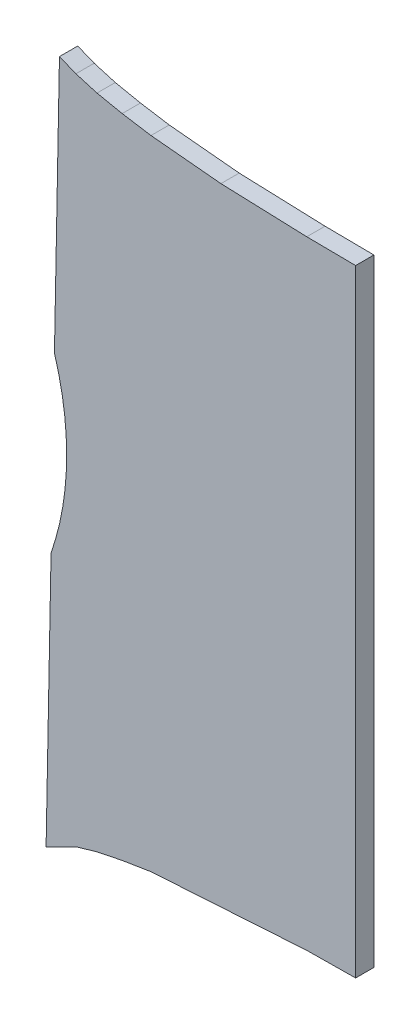
ISO-10303-21;
HEADER;
FILE_DESCRIPTION(('STEP AP214'),'2;1');
FILE_NAME('part.step','',(''),(''),'','','');
FILE_SCHEMA(('AUTOMOTIVE_DESIGN { 1 0 10303 214 1 1 1 1 }'));
ENDSEC;
DATA;
#1=APPLICATION_CONTEXT('core data for automotive mechanical design processes');
#2=APPLICATION_PROTOCOL_DEFINITION('international standard','automotive_design',2000,#1);
#3=PRODUCT_CONTEXT('',#1,'mechanical');
#4=PRODUCT('Part','Part','',(#3));
#5=PRODUCT_RELATED_PRODUCT_CATEGORY('part','',(#4));
#6=PRODUCT_DEFINITION_FORMATION('','',#4);
#7=PRODUCT_DEFINITION_CONTEXT('part definition',#1,'design');
#8=PRODUCT_DEFINITION('design','',#6,#7);
#9=PRODUCT_DEFINITION_SHAPE('','',#8);
#10=(LENGTH_UNIT() NAMED_UNIT(*) SI_UNIT(.MILLI.,.METRE.));
#11=(NAMED_UNIT(*) PLANE_ANGLE_UNIT() SI_UNIT($,.RADIAN.));
#12=(NAMED_UNIT(*) SI_UNIT($,.STERADIAN.) SOLID_ANGLE_UNIT());
#13=UNCERTAINTY_MEASURE_WITH_UNIT(LENGTH_MEASURE(1.E-05),#10,'distance_accuracy_value','');
#14=(GEOMETRIC_REPRESENTATION_CONTEXT(3) GLOBAL_UNCERTAINTY_ASSIGNED_CONTEXT((#13)) GLOBAL_UNIT_ASSIGNED_CONTEXT((#10,
#11,#12)) REPRESENTATION_CONTEXT('',''));
#15=CARTESIAN_POINT('',(0.,0.,0.));
#16=DIRECTION('',(0.,0.,1.));
#17=DIRECTION('',(1.,0.,0.));
#18=AXIS2_PLACEMENT_3D('',#15,#16,#17);
#19=CARTESIAN_POINT('',(86.8539962768555,70.0309982299805,0.));
#20=DIRECTION('',(-1.,0.,0.));
#21=DIRECTION('',(0.,1.,0.));
#22=AXIS2_PLACEMENT_3D('',#19,#20,#21);
#23=PLANE('',#22);
#24=DIRECTION('',(0.,1.,0.));
#25=VECTOR('',#24,1.);
#26=CARTESIAN_POINT('',(86.8539962768555,70.0309982299805,0.03556));
#27=LINE('',#26,#25);
#28=CARTESIAN_POINT('',(86.8539962768555,70.0309982299805,0.03556));
#29=VERTEX_POINT('',#28);
#30=CARTESIAN_POINT('',(86.8539962768555,71.2310028076172,0.03556));
#31=VERTEX_POINT('',#30);
#32=EDGE_CURVE('E11',#29,#31,#27,.T.);
#33=ORIENTED_EDGE('',*,*,#32,.F.);
#34=DIRECTION('',(0.,0.,1.));
#35=VECTOR('',#34,1.);
#36=CARTESIAN_POINT('',(86.8539962768555,70.0309982299805,0.));
#37=LINE('',#36,#35);
#38=CARTESIAN_POINT('',(86.8539962768555,70.0309982299805,0.));
#39=VERTEX_POINT('',#38);
#40=EDGE_CURVE('E24',#39,#29,#37,.T.);
#41=ORIENTED_EDGE('',*,*,#40,.F.);
#42=DIRECTION('',(0.,1.,0.));
#43=VECTOR('',#42,1.);
#44=CARTESIAN_POINT('',(86.8539962768555,70.0309982299805,0.));
#45=LINE('',#44,#43);
#46=CARTESIAN_POINT('',(86.8539962768555,71.2310028076172,0.));
#47=VERTEX_POINT('',#46);
#48=EDGE_CURVE('E281',#39,#47,#45,.T.);
#49=ORIENTED_EDGE('',*,*,#48,.T.);
#50=DIRECTION('',(0.,0.,1.));
#51=VECTOR('',#50,1.);
#52=CARTESIAN_POINT('',(86.8539962768555,71.2310028076172,0.));
#53=LINE('',#52,#51);
#54=EDGE_CURVE('E37',#47,#31,#53,.T.);
#55=ORIENTED_EDGE('',*,*,#54,.T.);
#56=EDGE_LOOP('',(#33,#41,#49,#55));
#57=FACE_BOUND('',#56,.T.);
#58=ADVANCED_FACE('F17',(#57),#23,.F.);
#59=CARTESIAN_POINT('',(86.7590026855469,70.0299987792969,0.));
#60=DIRECTION('',(-0.0105206609892561,0.999944656314713,0.));
#61=DIRECTION('',(0.999944656314713,0.0105206609892561,0.));
#62=AXIS2_PLACEMENT_3D('',#59,#60,#61);
#63=PLANE('',#62);
#64=DIRECTION('',(0.999944656314713,0.0105206609892561,0.));
#65=VECTOR('',#64,1.);
#66=CARTESIAN_POINT('',(86.7590026855469,70.0299987792969,0.03556));
#67=LINE('',#66,#65);
#68=CARTESIAN_POINT('',(86.7590026855469,70.0299987792969,0.03556));
#69=VERTEX_POINT('',#68);
#70=EDGE_CURVE('E277',#69,#29,#67,.T.);
#71=ORIENTED_EDGE('',*,*,#70,.F.);
#72=DIRECTION('',(0.,0.,1.));
#73=VECTOR('',#72,1.);
#74=CARTESIAN_POINT('',(86.7590026855469,70.0299987792969,0.));
#75=LINE('',#74,#73);
#76=CARTESIAN_POINT('',(86.7590026855469,70.0299987792969,0.));
#77=VERTEX_POINT('',#76);
#78=EDGE_CURVE('E275',#77,#69,#75,.T.);
#79=ORIENTED_EDGE('',*,*,#78,.F.);
#80=DIRECTION('',(0.999944656314713,0.0105206609892561,0.));
#81=VECTOR('',#80,1.);
#82=CARTESIAN_POINT('',(86.7590026855469,70.0299987792969,0.));
#83=LINE('',#82,#81);
#84=EDGE_CURVE('E273',#77,#39,#83,.T.);
#85=ORIENTED_EDGE('',*,*,#84,.T.);
#86=ORIENTED_EDGE('',*,*,#40,.T.);
#87=EDGE_LOOP('',(#71,#79,#85,#86));
#88=FACE_BOUND('',#87,.T.);
#89=ADVANCED_FACE('F284',(#88),#63,.F.);
#90=CARTESIAN_POINT('',(86.4560012817383,70.0110015869141,0.));
#91=DIRECTION('',(-0.0625738496276475,0.998040336530932,0.));
#92=DIRECTION('',(0.998040336530932,0.0625738496276475,0.));
#93=AXIS2_PLACEMENT_3D('',#90,#91,#92);
#94=PLANE('',#93);
#95=DIRECTION('',(0.998040336530932,0.0625738496276475,0.));
#96=VECTOR('',#95,1.);
#97=CARTESIAN_POINT('',(86.4560012817383,70.0110015869141,0.03556));
#98=LINE('',#97,#96);
#99=CARTESIAN_POINT('',(86.4560012817383,70.0110015869141,0.03556));
#100=VERTEX_POINT('',#99);
#101=EDGE_CURVE('E270',#100,#69,#98,.T.);
#102=ORIENTED_EDGE('',*,*,#101,.F.);
#103=DIRECTION('',(0.,0.,1.));
#104=VECTOR('',#103,1.);
#105=CARTESIAN_POINT('',(86.4560012817383,70.0110015869141,0.));
#106=LINE('',#105,#104);
#107=CARTESIAN_POINT('',(86.4560012817383,70.0110015869141,0.));
#108=VERTEX_POINT('',#107);
#109=EDGE_CURVE('E268',#108,#100,#106,.T.);
#110=ORIENTED_EDGE('',*,*,#109,.F.);
#111=DIRECTION('',(0.998040336530932,0.0625738496276475,0.));
#112=VECTOR('',#111,1.);
#113=CARTESIAN_POINT('',(86.4560012817383,70.0110015869141,0.));
#114=LINE('',#113,#112);
#115=EDGE_CURVE('E265',#108,#77,#114,.T.);
#116=ORIENTED_EDGE('',*,*,#115,.T.);
#117=ORIENTED_EDGE('',*,*,#78,.T.);
#118=EDGE_LOOP('',(#102,#110,#116,#117));
#119=FACE_BOUND('',#118,.T.);
#120=ADVANCED_FACE('F287',(#119),#94,.F.);
#121=CARTESIAN_POINT('',(86.4000015258789,70.0019989013672,0.));
#122=DIRECTION('',(-0.158724925844647,0.987322843813315,0.));
#123=DIRECTION('',(0.987322843813315,0.158724925844647,0.));
#124=AXIS2_PLACEMENT_3D('',#121,#122,#123);
#125=PLANE('',#124);
#126=DIRECTION('',(0.987322843813315,0.158724925844647,0.));
#127=VECTOR('',#126,1.);
#128=CARTESIAN_POINT('',(86.4000015258789,70.0019989013672,0.03556));
#129=LINE('',#128,#127);
#130=CARTESIAN_POINT('',(86.4000015258789,70.0019989013672,0.03556));
#131=VERTEX_POINT('',#130);
#132=EDGE_CURVE('E262',#131,#100,#129,.T.);
#133=ORIENTED_EDGE('',*,*,#132,.F.);
#134=DIRECTION('',(0.,0.,1.));
#135=VECTOR('',#134,1.);
#136=CARTESIAN_POINT('',(86.4000015258789,70.0019989013672,0.));
#137=LINE('',#136,#135);
#138=CARTESIAN_POINT('',(86.4000015258789,70.0019989013672,0.));
#139=VERTEX_POINT('',#138);
#140=EDGE_CURVE('E260',#139,#131,#137,.T.);
#141=ORIENTED_EDGE('',*,*,#140,.F.);
#142=DIRECTION('',(0.987322843813315,0.158724925844647,0.));
#143=VECTOR('',#142,1.);
#144=CARTESIAN_POINT('',(86.4000015258789,70.0019989013672,0.));
#145=LINE('',#144,#143);
#146=EDGE_CURVE('E257',#139,#108,#145,.T.);
#147=ORIENTED_EDGE('',*,*,#146,.T.);
#148=ORIENTED_EDGE('',*,*,#109,.T.);
#149=EDGE_LOOP('',(#133,#141,#147,#148));
#150=FACE_BOUND('',#149,.T.);
#151=ADVANCED_FACE('F292',(#150),#125,.F.);
#152=CARTESIAN_POINT('',(86.3509979248047,69.9919967651367,0.));
#153=DIRECTION('',(-0.199986910155218,0.979798568975567,0.));
#154=DIRECTION('',(0.979798568975567,0.199986910155218,0.));
#155=AXIS2_PLACEMENT_3D('',#152,#153,#154);
#156=PLANE('',#155);
#157=DIRECTION('',(0.979798568975567,0.199986910155218,0.));
#158=VECTOR('',#157,1.);
#159=CARTESIAN_POINT('',(86.3509979248047,69.9919967651367,0.03556));
#160=LINE('',#159,#158);
#161=CARTESIAN_POINT('',(86.3509979248047,69.9919967651367,0.03556));
#162=VERTEX_POINT('',#161);
#163=EDGE_CURVE('E254',#162,#131,#160,.T.);
#164=ORIENTED_EDGE('',*,*,#163,.F.);
#165=DIRECTION('',(0.,0.,1.));
#166=VECTOR('',#165,1.);
#167=CARTESIAN_POINT('',(86.3509979248047,69.9919967651367,0.));
#168=LINE('',#167,#166);
#169=CARTESIAN_POINT('',(86.3509979248047,69.9919967651367,0.));
#170=VERTEX_POINT('',#169);
#171=EDGE_CURVE('E252',#170,#162,#168,.T.);
#172=ORIENTED_EDGE('',*,*,#171,.F.);
#173=DIRECTION('',(0.979798568975567,0.199986910155218,0.));
#174=VECTOR('',#173,1.);
#175=CARTESIAN_POINT('',(86.3509979248047,69.9919967651367,0.));
#176=LINE('',#175,#174);
#177=EDGE_CURVE('E249',#170,#139,#176,.T.);
#178=ORIENTED_EDGE('',*,*,#177,.T.);
#179=ORIENTED_EDGE('',*,*,#140,.T.);
#180=EDGE_LOOP('',(#164,#172,#178,#179));
#181=FACE_BOUND('',#180,.T.);
#182=ADVANCED_FACE('F295',(#181),#156,.F.);
#183=CARTESIAN_POINT('',(86.3099975585938,69.9800033569336,0.));
#184=DIRECTION('',(-0.280754306798625,0.959779672223799,0.));
#185=DIRECTION('',(0.959779672223799,0.280754306798625,0.));
#186=AXIS2_PLACEMENT_3D('',#183,#184,#185);
#187=PLANE('',#186);
#188=DIRECTION('',(0.959779672223799,0.280754306798625,0.));
#189=VECTOR('',#188,1.);
#190=CARTESIAN_POINT('',(86.3099975585938,69.9800033569336,0.03556));
#191=LINE('',#190,#189);
#192=CARTESIAN_POINT('',(86.3099975585938,69.9800033569336,0.03556));
#193=VERTEX_POINT('',#192);
#194=EDGE_CURVE('E246',#193,#162,#191,.T.);
#195=ORIENTED_EDGE('',*,*,#194,.F.);
#196=DIRECTION('',(0.,0.,1.));
#197=VECTOR('',#196,1.);
#198=CARTESIAN_POINT('',(86.3099975585938,69.9800033569336,0.));
#199=LINE('',#198,#197);
#200=CARTESIAN_POINT('',(86.3099975585938,69.9800033569336,0.));
#201=VERTEX_POINT('',#200);
#202=EDGE_CURVE('E244',#201,#193,#199,.T.);
#203=ORIENTED_EDGE('',*,*,#202,.F.);
#204=DIRECTION('',(0.959779672223799,0.280754306798625,0.));
#205=VECTOR('',#204,1.);
#206=CARTESIAN_POINT('',(86.3099975585938,69.9800033569336,0.));
#207=LINE('',#206,#205);
#208=EDGE_CURVE('E241',#201,#170,#207,.T.);
#209=ORIENTED_EDGE('',*,*,#208,.T.);
#210=ORIENTED_EDGE('',*,*,#171,.T.);
#211=EDGE_LOOP('',(#195,#203,#209,#210));
#212=FACE_BOUND('',#211,.T.);
#213=ADVANCED_FACE('F300',(#212),#187,.F.);
#214=CARTESIAN_POINT('',(86.2519989013672,69.9509963989258,0.));
#215=DIRECTION('',(-0.447307713531729,0.894380125793847,0.));
#216=DIRECTION('',(0.894380125793847,0.447307713531729,0.));
#217=AXIS2_PLACEMENT_3D('',#214,#215,#216);
#218=PLANE('',#217);
#219=DIRECTION('',(0.894380125793847,0.447307713531729,0.));
#220=VECTOR('',#219,1.);
#221=CARTESIAN_POINT('',(86.2519989013672,69.9509963989258,0.03556));
#222=LINE('',#221,#220);
#223=CARTESIAN_POINT('',(86.2519989013672,69.9509963989258,0.03556));
#224=VERTEX_POINT('',#223);
#225=EDGE_CURVE('E238',#224,#193,#222,.T.);
#226=ORIENTED_EDGE('',*,*,#225,.F.);
#227=DIRECTION('',(0.,0.,1.));
#228=VECTOR('',#227,1.);
#229=CARTESIAN_POINT('',(86.2519989013672,69.9509963989258,0.));
#230=LINE('',#229,#228);
#231=CARTESIAN_POINT('',(86.2519989013672,69.9509963989258,0.));
#232=VERTEX_POINT('',#231);
#233=EDGE_CURVE('E236',#232,#224,#230,.T.);
#234=ORIENTED_EDGE('',*,*,#233,.F.);
#235=DIRECTION('',(0.894380125793847,0.447307713531729,0.));
#236=VECTOR('',#235,1.);
#237=CARTESIAN_POINT('',(86.2519989013672,69.9509963989258,0.));
#238=LINE('',#237,#236);
#239=EDGE_CURVE('E233',#232,#201,#238,.T.);
#240=ORIENTED_EDGE('',*,*,#239,.T.);
#241=ORIENTED_EDGE('',*,*,#202,.T.);
#242=EDGE_LOOP('',(#226,#234,#240,#241));
#243=FACE_BOUND('',#242,.T.);
#244=ADVANCED_FACE('F303',(#243),#218,.F.);
#245=CARTESIAN_POINT('',(86.2616654696204,70.4506655098549,0.));
#246=DIRECTION('',(0.999812919829315,-0.0193423199844364,0.));
#247=DIRECTION('',(-0.0193423199844364,-0.999812919829315,0.));
#248=AXIS2_PLACEMENT_3D('',#245,#246,#247);
#249=PLANE('',#248);
#250=DIRECTION('',(-0.0193423199844364,-0.999812919829315,0.));
#251=VECTOR('',#250,1.);
#252=CARTESIAN_POINT('',(86.2779998779297,71.2949981689453,0.03556));
#253=LINE('',#252,#251);
#254=CARTESIAN_POINT('',(86.2616654696204,70.4506655098549,0.03556));
#255=VERTEX_POINT('',#254);
#256=EDGE_CURVE('E230',#255,#224,#253,.T.);
#257=ORIENTED_EDGE('',*,*,#256,.F.);
#258=DIRECTION('',(0.,0.,1.));
#259=VECTOR('',#258,1.);
#260=CARTESIAN_POINT('',(86.2616654696204,70.4506655098549,0.));
#261=LINE('',#260,#259);
#262=CARTESIAN_POINT('',(86.2616654696204,70.4506655098549,0.));
#263=VERTEX_POINT('',#262);
#264=EDGE_CURVE('E228',#263,#255,#261,.T.);
#265=ORIENTED_EDGE('',*,*,#264,.F.);
#266=DIRECTION('',(-0.0193423199844364,-0.999812919829315,0.));
#267=VECTOR('',#266,1.);
#268=CARTESIAN_POINT('',(86.2779998779297,71.2949981689453,0.));
#269=LINE('',#268,#267);
#270=EDGE_CURVE('E225',#263,#232,#269,.T.);
#271=ORIENTED_EDGE('',*,*,#270,.T.);
#272=ORIENTED_EDGE('',*,*,#233,.T.);
#273=EDGE_LOOP('',(#257,#265,#271,#272));
#274=FACE_BOUND('',#273,.T.);
#275=ADVANCED_FACE('F308',(#274),#249,.F.);
#276=CARTESIAN_POINT('',(85.742018,70.6308468,0.));
#277=DIRECTION('',(0.,0.,-1.));
#278=DIRECTION('',(1.,0.,0.));
#279=AXIS2_PLACEMENT_3D('',#276,#277,#278);
#280=CYLINDRICAL_SURFACE('',#279,0.5499989);
#281=ORIENTED_EDGE('',*,*,#264,.T.);
#282=CARTESIAN_POINT('',(85.742018,70.6308468,0.03556));
#283=DIRECTION('',(0.,0.,1.));
#284=DIRECTION('',(1.,0.,0.));
#285=AXIS2_PLACEMENT_3D('',#282,#283,#284);
#286=CIRCLE('',#285,0.5499989);
#287=CARTESIAN_POINT('',(86.2920169,70.6308468,0.03556));
#288=VERTEX_POINT('',#287);
#289=EDGE_CURVE('E222',#255,#288,#286,.T.);
#290=ORIENTED_EDGE('',*,*,#289,.T.);
#291=DIRECTION('',(0.,0.,1.));
#292=VECTOR('',#291,1.);
#293=CARTESIAN_POINT('',(86.2920169,70.6308468,0.));
#294=LINE('',#293,#292);
#295=CARTESIAN_POINT('',(86.2920169,70.6308468,0.));
#296=VERTEX_POINT('',#295);
#297=EDGE_CURVE('E220',#296,#288,#294,.T.);
#298=ORIENTED_EDGE('',*,*,#297,.F.);
#299=CARTESIAN_POINT('',(85.742018,70.6308468,0.));
#300=DIRECTION('',(0.,0.,1.));
#301=DIRECTION('',(1.,0.,0.));
#302=AXIS2_PLACEMENT_3D('',#299,#300,#301);
#303=CIRCLE('',#302,0.5499989);
#304=EDGE_CURVE('E217',#263,#296,#303,.T.);
#305=ORIENTED_EDGE('',*,*,#304,.F.);
#306=EDGE_LOOP('',(#281,#290,#298,#305));
#307=FACE_BOUND('',#306,.T.);
#308=ADVANCED_FACE('F311',(#307),#280,.F.);
#309=CARTESIAN_POINT('',(85.742018,70.6308468,0.));
#310=DIRECTION('',(0.,0.,-1.));
#311=DIRECTION('',(1.,0.,0.));
#312=AXIS2_PLACEMENT_3D('',#309,#310,#311);
#313=CYLINDRICAL_SURFACE('',#312,0.5499989);
#314=ORIENTED_EDGE('',*,*,#297,.T.);
#315=CARTESIAN_POINT('',(85.742018,70.6308468,0.03556));
#316=DIRECTION('',(0.,0.,1.));
#317=DIRECTION('',(1.,0.,0.));
#318=AXIS2_PLACEMENT_3D('',#315,#316,#317);
#319=CIRCLE('',#318,0.5499989);
#320=CARTESIAN_POINT('',(86.2682455873885,70.7907946548541,0.03556));
#321=VERTEX_POINT('',#320);
#322=EDGE_CURVE('E214',#288,#321,#319,.T.);
#323=ORIENTED_EDGE('',*,*,#322,.T.);
#324=DIRECTION('',(0.,0.,1.));
#325=VECTOR('',#324,1.);
#326=CARTESIAN_POINT('',(86.2682455873885,70.7907946548541,0.));
#327=LINE('',#326,#325);
#328=CARTESIAN_POINT('',(86.2682455873885,70.7907946548541,0.));
#329=VERTEX_POINT('',#328);
#330=EDGE_CURVE('E212',#329,#321,#327,.T.);
#331=ORIENTED_EDGE('',*,*,#330,.F.);
#332=EDGE_CURVE('E211',#296,#329,#303,.T.);
#333=ORIENTED_EDGE('',*,*,#332,.F.);
#334=EDGE_LOOP('',(#314,#323,#331,#333));
#335=FACE_BOUND('',#334,.T.);
#336=ADVANCED_FACE('F318',(#335),#313,.F.);
#337=CARTESIAN_POINT('',(86.2779998779297,71.2949981689453,0.));
#338=DIRECTION('',(0.999812919829315,-0.0193423199844364,0.));
#339=DIRECTION('',(-0.0193423199844364,-0.999812919829315,0.));
#340=AXIS2_PLACEMENT_3D('',#337,#338,#339);
#341=PLANE('',#340);
#342=DIRECTION('',(-0.0193423199844364,-0.999812919829315,0.));
#343=VECTOR('',#342,1.);
#344=CARTESIAN_POINT('',(86.2779998779297,71.2949981689453,0.03556));
#345=LINE('',#344,#343);
#346=CARTESIAN_POINT('',(86.2779998779297,71.2949981689453,0.03556));
#347=VERTEX_POINT('',#346);
#348=EDGE_CURVE('E208',#347,#321,#345,.T.);
#349=ORIENTED_EDGE('',*,*,#348,.F.);
#350=DIRECTION('',(0.,0.,1.));
#351=VECTOR('',#350,1.);
#352=CARTESIAN_POINT('',(86.2779998779297,71.2949981689453,0.));
#353=LINE('',#352,#351);
#354=CARTESIAN_POINT('',(86.2779998779297,71.2949981689453,0.));
#355=VERTEX_POINT('',#354);
#356=EDGE_CURVE('E206',#355,#347,#353,.T.);
#357=ORIENTED_EDGE('',*,*,#356,.F.);
#358=EDGE_CURVE('E205',#355,#329,#269,.T.);
#359=ORIENTED_EDGE('',*,*,#358,.T.);
#360=ORIENTED_EDGE('',*,*,#330,.T.);
#361=EDGE_LOOP('',(#349,#357,#359,#360));
#362=FACE_BOUND('',#361,.T.);
#363=ADVANCED_FACE('F321',(#362),#341,.F.);
#364=CARTESIAN_POINT('',(86.3099975585938,71.2819976806641,0.));
#365=DIRECTION('',(-0.376412597967261,-0.926452133729281,0.));
#366=DIRECTION('',(-0.926452133729281,0.376412597967261,0.));
#367=AXIS2_PLACEMENT_3D('',#364,#365,#366);
#368=PLANE('',#367);
#369=DIRECTION('',(-0.926452133729281,0.376412597967261,0.));
#370=VECTOR('',#369,1.);
#371=CARTESIAN_POINT('',(86.3099975585938,71.2819976806641,0.03556));
#372=LINE('',#371,#370);
#373=CARTESIAN_POINT('',(86.3099975585938,71.2819976806641,0.03556));
#374=VERTEX_POINT('',#373);
#375=EDGE_CURVE('E202',#374,#347,#372,.T.);
#376=ORIENTED_EDGE('',*,*,#375,.F.);
#377=DIRECTION('',(0.,0.,1.));
#378=VECTOR('',#377,1.);
#379=CARTESIAN_POINT('',(86.3099975585938,71.2819976806641,0.));
#380=LINE('',#379,#378);
#381=CARTESIAN_POINT('',(86.3099975585938,71.2819976806641,0.));
#382=VERTEX_POINT('',#381);
#383=EDGE_CURVE('E200',#382,#374,#380,.T.);
#384=ORIENTED_EDGE('',*,*,#383,.F.);
#385=DIRECTION('',(-0.926452133729281,0.376412597967261,0.));
#386=VECTOR('',#385,1.);
#387=CARTESIAN_POINT('',(86.3099975585938,71.2819976806641,0.));
#388=LINE('',#387,#386);
#389=EDGE_CURVE('E197',#382,#355,#388,.T.);
#390=ORIENTED_EDGE('',*,*,#389,.T.);
#391=ORIENTED_EDGE('',*,*,#356,.T.);
#392=EDGE_LOOP('',(#376,#384,#390,#391));
#393=FACE_BOUND('',#392,.T.);
#394=ADVANCED_FACE('F326',(#393),#368,.F.);
#395=CARTESIAN_POINT('',(86.3509979248047,71.2699966430664,0.));
#396=DIRECTION('',(-0.280918813771343,-0.959731535414619,0.));
#397=DIRECTION('',(-0.959731535414619,0.280918813771343,0.));
#398=AXIS2_PLACEMENT_3D('',#395,#396,#397);
#399=PLANE('',#398);
#400=DIRECTION('',(-0.959731535414619,0.280918813771343,0.));
#401=VECTOR('',#400,1.);
#402=CARTESIAN_POINT('',(86.3509979248047,71.2699966430664,0.03556));
#403=LINE('',#402,#401);
#404=CARTESIAN_POINT('',(86.3509979248047,71.2699966430664,0.03556));
#405=VERTEX_POINT('',#404);
#406=EDGE_CURVE('E194',#405,#374,#403,.T.);
#407=ORIENTED_EDGE('',*,*,#406,.F.);
#408=DIRECTION('',(0.,0.,1.));
#409=VECTOR('',#408,1.);
#410=CARTESIAN_POINT('',(86.3509979248047,71.2699966430664,0.));
#411=LINE('',#410,#409);
#412=CARTESIAN_POINT('',(86.3509979248047,71.2699966430664,0.));
#413=VERTEX_POINT('',#412);
#414=EDGE_CURVE('E192',#413,#405,#411,.T.);
#415=ORIENTED_EDGE('',*,*,#414,.F.);
#416=DIRECTION('',(-0.959731535414619,0.280918813771343,0.));
#417=VECTOR('',#416,1.);
#418=CARTESIAN_POINT('',(86.3509979248047,71.2699966430664,0.));
#419=LINE('',#418,#417);
#420=EDGE_CURVE('E189',#413,#382,#419,.T.);
#421=ORIENTED_EDGE('',*,*,#420,.T.);
#422=ORIENTED_EDGE('',*,*,#383,.T.);
#423=EDGE_LOOP('',(#407,#415,#421,#422));
#424=FACE_BOUND('',#423,.T.);
#425=ADVANCED_FACE('F329',(#424),#399,.F.);
#426=CARTESIAN_POINT('',(86.4000015258789,71.2600021362305,0.));
#427=DIRECTION('',(-0.199840459152507,-0.97982844972256,0.));
#428=DIRECTION('',(-0.97982844972256,0.199840459152507,0.));
#429=AXIS2_PLACEMENT_3D('',#426,#427,#428);
#430=PLANE('',#429);
#431=DIRECTION('',(-0.97982844972256,0.199840459152507,0.));
#432=VECTOR('',#431,1.);
#433=CARTESIAN_POINT('',(86.4000015258789,71.2600021362305,0.03556));
#434=LINE('',#433,#432);
#435=CARTESIAN_POINT('',(86.4000015258789,71.2600021362305,0.03556));
#436=VERTEX_POINT('',#435);
#437=EDGE_CURVE('E186',#436,#405,#434,.T.);
#438=ORIENTED_EDGE('',*,*,#437,.F.);
#439=DIRECTION('',(0.,0.,1.));
#440=VECTOR('',#439,1.);
#441=CARTESIAN_POINT('',(86.4000015258789,71.2600021362305,0.));
#442=LINE('',#441,#440);
#443=CARTESIAN_POINT('',(86.4000015258789,71.2600021362305,0.));
#444=VERTEX_POINT('',#443);
#445=EDGE_CURVE('E184',#444,#436,#442,.T.);
#446=ORIENTED_EDGE('',*,*,#445,.F.);
#447=DIRECTION('',(-0.97982844972256,0.199840459152507,0.));
#448=VECTOR('',#447,1.);
#449=CARTESIAN_POINT('',(86.4000015258789,71.2600021362305,0.));
#450=LINE('',#449,#448);
#451=EDGE_CURVE('E181',#444,#413,#450,.T.);
#452=ORIENTED_EDGE('',*,*,#451,.T.);
#453=ORIENTED_EDGE('',*,*,#414,.T.);
#454=EDGE_LOOP('',(#438,#446,#452,#453));
#455=FACE_BOUND('',#454,.T.);
#456=ADVANCED_FACE('F333',(#455),#430,.F.);
#457=CARTESIAN_POINT('',(86.4560012817383,71.2509994506836,0.));
#458=DIRECTION('',(-0.158724925844647,-0.987322843813315,0.));
#459=DIRECTION('',(-0.987322843813315,0.158724925844647,0.));
#460=AXIS2_PLACEMENT_3D('',#457,#458,#459);
#461=PLANE('',#460);
#462=DIRECTION('',(-0.987322843813315,0.158724925844647,0.));
#463=VECTOR('',#462,1.);
#464=CARTESIAN_POINT('',(86.4560012817383,71.2509994506836,0.03556));
#465=LINE('',#464,#463);
#466=CARTESIAN_POINT('',(86.4560012817383,71.2509994506836,0.03556));
#467=VERTEX_POINT('',#466);
#468=EDGE_CURVE('E178',#467,#436,#465,.T.);
#469=ORIENTED_EDGE('',*,*,#468,.F.);
#470=DIRECTION('',(0.,0.,1.));
#471=VECTOR('',#470,1.);
#472=CARTESIAN_POINT('',(86.4560012817383,71.2509994506836,0.));
#473=LINE('',#472,#471);
#474=CARTESIAN_POINT('',(86.4560012817383,71.2509994506836,0.));
#475=VERTEX_POINT('',#474);
#476=EDGE_CURVE('E176',#475,#467,#473,.T.);
#477=ORIENTED_EDGE('',*,*,#476,.F.);
#478=DIRECTION('',(-0.987322843813315,0.158724925844647,0.));
#479=VECTOR('',#478,1.);
#480=CARTESIAN_POINT('',(86.4560012817383,71.2509994506836,0.));
#481=LINE('',#480,#479);
#482=EDGE_CURVE('E173',#475,#444,#481,.T.);
#483=ORIENTED_EDGE('',*,*,#482,.T.);
#484=ORIENTED_EDGE('',*,*,#445,.T.);
#485=EDGE_LOOP('',(#469,#477,#483,#484));
#486=FACE_BOUND('',#485,.T.);
#487=ADVANCED_FACE('F336',(#486),#461,.F.);
#488=CARTESIAN_POINT('',(86.5920028686523,71.2379989624023,0.));
#489=DIRECTION('',(-0.0951569465430121,-0.99546228232144,0.));
#490=DIRECTION('',(-0.99546228232144,0.0951569465430121,0.));
#491=AXIS2_PLACEMENT_3D('',#488,#489,#490);
#492=PLANE('',#491);
#493=DIRECTION('',(-0.99546228232144,0.0951569465430121,0.));
#494=VECTOR('',#493,1.);
#495=CARTESIAN_POINT('',(86.5920028686523,71.2379989624023,0.03556));
#496=LINE('',#495,#494);
#497=CARTESIAN_POINT('',(86.5920028686523,71.2379989624023,0.03556));
#498=VERTEX_POINT('',#497);
#499=EDGE_CURVE('E170',#498,#467,#496,.T.);
#500=ORIENTED_EDGE('',*,*,#499,.F.);
#501=DIRECTION('',(0.,0.,1.));
#502=VECTOR('',#501,1.);
#503=CARTESIAN_POINT('',(86.5920028686523,71.2379989624023,0.));
#504=LINE('',#503,#502);
#505=CARTESIAN_POINT('',(86.5920028686523,71.2379989624023,0.));
#506=VERTEX_POINT('',#505);
#507=EDGE_CURVE('E168',#506,#498,#504,.T.);
#508=ORIENTED_EDGE('',*,*,#507,.F.);
#509=DIRECTION('',(-0.99546228232144,0.0951569465430121,0.));
#510=VECTOR('',#509,1.);
#511=CARTESIAN_POINT('',(86.5920028686523,71.2379989624023,0.));
#512=LINE('',#511,#510);
#513=EDGE_CURVE('E159',#506,#475,#512,.T.);
#514=ORIENTED_EDGE('',*,*,#513,.T.);
#515=ORIENTED_EDGE('',*,*,#476,.T.);
#516=EDGE_LOOP('',(#500,#508,#514,#515));
#517=FACE_BOUND('',#516,.T.);
#518=ADVANCED_FACE('F339',(#517),#492,.F.);
#519=CARTESIAN_POINT('',(86.7590026855469,71.2320022583008,0.));
#520=DIRECTION('',(-0.0358853190556377,-0.999355914515082,0.));
#521=DIRECTION('',(-0.999355914515082,0.0358853190556377,0.));
#522=AXIS2_PLACEMENT_3D('',#519,#520,#521);
#523=PLANE('',#522);
#524=DIRECTION('',(-0.999355914515082,0.0358853190556377,0.));
#525=VECTOR('',#524,1.);
#526=CARTESIAN_POINT('',(86.7590026855469,71.2320022583008,0.03556));
#527=LINE('',#526,#525);
#528=CARTESIAN_POINT('',(86.7590026855469,71.2320022583008,0.03556));
#529=VERTEX_POINT('',#528);
#530=EDGE_CURVE('E145',#529,#498,#527,.T.);
#531=ORIENTED_EDGE('',*,*,#530,.F.);
#532=DIRECTION('',(0.,0.,1.));
#533=VECTOR('',#532,1.);
#534=CARTESIAN_POINT('',(86.7590026855469,71.2320022583008,0.));
#535=LINE('',#534,#533);
#536=CARTESIAN_POINT('',(86.7590026855469,71.2320022583008,0.));
#537=VERTEX_POINT('',#536);
#538=EDGE_CURVE('E140',#537,#529,#535,.T.);
#539=ORIENTED_EDGE('',*,*,#538,.F.);
#540=DIRECTION('',(-0.999355914515082,0.0358853190556377,0.));
#541=VECTOR('',#540,1.);
#542=CARTESIAN_POINT('',(86.7590026855469,71.2320022583008,0.));
#543=LINE('',#542,#541);
#544=EDGE_CURVE('E143',#537,#506,#543,.T.);
#545=ORIENTED_EDGE('',*,*,#544,.T.);
#546=ORIENTED_EDGE('',*,*,#507,.T.);
#547=EDGE_LOOP('',(#531,#539,#545,#546));
#548=FACE_BOUND('',#547,.T.);
#549=ADVANCED_FACE('F142',(#548),#523,.F.);
#550=CARTESIAN_POINT('',(86.8539962768555,71.2310028076172,0.));
#551=DIRECTION('',(-0.0105206609892561,-0.999944656314713,0.));
#552=DIRECTION('',(-0.999944656314713,0.0105206609892561,0.));
#553=AXIS2_PLACEMENT_3D('',#550,#551,#552);
#554=PLANE('',#553);
#555=DIRECTION('',(-0.999944656314713,0.0105206609892561,0.));
#556=VECTOR('',#555,1.);
#557=CARTESIAN_POINT('',(86.8539962768555,71.2310028076172,0.03556));
#558=LINE('',#557,#556);
#559=EDGE_CURVE('E160',#31,#529,#558,.T.);
#560=ORIENTED_EDGE('',*,*,#559,.F.);
#561=ORIENTED_EDGE('',*,*,#54,.F.);
#562=DIRECTION('',(-0.999944656314713,0.0105206609892561,0.));
#563=VECTOR('',#562,1.);
#564=CARTESIAN_POINT('',(86.8539962768555,71.2310028076172,0.));
#565=LINE('',#564,#563);
#566=EDGE_CURVE('E156',#47,#537,#565,.T.);
#567=ORIENTED_EDGE('',*,*,#566,.T.);
#568=ORIENTED_EDGE('',*,*,#538,.T.);
#569=EDGE_LOOP('',(#560,#561,#567,#568));
#570=FACE_BOUND('',#569,.T.);
#571=ADVANCED_FACE('F162',(#570),#554,.F.);
#572=CARTESIAN_POINT('',(86.8539962768555,71.2310028076172,0.));
#573=DIRECTION('',(0.,0.,1.));
#574=DIRECTION('',(1.,0.,0.));
#575=AXIS2_PLACEMENT_3D('',#572,#573,#574);
#576=PLANE('',#575);
#577=ORIENTED_EDGE('',*,*,#566,.F.);
#578=ORIENTED_EDGE('',*,*,#48,.F.);
#579=ORIENTED_EDGE('',*,*,#84,.F.);
#580=ORIENTED_EDGE('',*,*,#115,.F.);
#581=ORIENTED_EDGE('',*,*,#146,.F.);
#582=ORIENTED_EDGE('',*,*,#177,.F.);
#583=ORIENTED_EDGE('',*,*,#208,.F.);
#584=ORIENTED_EDGE('',*,*,#239,.F.);
#585=ORIENTED_EDGE('',*,*,#270,.F.);
#586=ORIENTED_EDGE('',*,*,#304,.T.);
#587=ORIENTED_EDGE('',*,*,#332,.T.);
#588=ORIENTED_EDGE('',*,*,#358,.F.);
#589=ORIENTED_EDGE('',*,*,#389,.F.);
#590=ORIENTED_EDGE('',*,*,#420,.F.);
#591=ORIENTED_EDGE('',*,*,#451,.F.);
#592=ORIENTED_EDGE('',*,*,#482,.F.);
#593=ORIENTED_EDGE('',*,*,#513,.F.);
#594=ORIENTED_EDGE('',*,*,#544,.F.);
#595=EDGE_LOOP('',(#577,#578,#579,#580,#581,#582,#583,#584,#585,#586,#587,#588,#589,#590,#591,
#592,#593,#594));
#596=FACE_BOUND('',#595,.T.);
#597=ADVANCED_FACE('F154',(#596),#576,.F.);
#598=CARTESIAN_POINT('',(86.8539962768555,71.2310028076172,0.03556));
#599=DIRECTION('',(0.,0.,1.));
#600=DIRECTION('',(1.,0.,0.));
#601=AXIS2_PLACEMENT_3D('',#598,#599,#600);
#602=PLANE('',#601);
#603=ORIENTED_EDGE('',*,*,#32,.T.);
#604=ORIENTED_EDGE('',*,*,#559,.T.);
#605=ORIENTED_EDGE('',*,*,#530,.T.);
#606=ORIENTED_EDGE('',*,*,#499,.T.);
#607=ORIENTED_EDGE('',*,*,#468,.T.);
#608=ORIENTED_EDGE('',*,*,#437,.T.);
#609=ORIENTED_EDGE('',*,*,#406,.T.);
#610=ORIENTED_EDGE('',*,*,#375,.T.);
#611=ORIENTED_EDGE('',*,*,#348,.T.);
#612=ORIENTED_EDGE('',*,*,#322,.F.);
#613=ORIENTED_EDGE('',*,*,#289,.F.);
#614=ORIENTED_EDGE('',*,*,#256,.T.);
#615=ORIENTED_EDGE('',*,*,#225,.T.);
#616=ORIENTED_EDGE('',*,*,#194,.T.);
#617=ORIENTED_EDGE('',*,*,#163,.T.);
#618=ORIENTED_EDGE('',*,*,#132,.T.);
#619=ORIENTED_EDGE('',*,*,#101,.T.);
#620=ORIENTED_EDGE('',*,*,#70,.T.);
#621=EDGE_LOOP('',(#603,#604,#605,#606,#607,#608,#609,#610,#611,#612,#613,#614,#615,#616,#617,
#618,#619,#620));
#622=FACE_BOUND('',#621,.T.);
#623=ADVANCED_FACE('F341',(#622),#602,.T.);
#624=CLOSED_SHELL('',(#58,#89,#120,#151,#182,#213,#244,#275,#308,#336,#363,#394,#425,#456,#487,
#518,#549,#571,#597,#623));
#625=MANIFOLD_SOLID_BREP('B1',#624);
#626=ADVANCED_BREP_SHAPE_REPRESENTATION('',(#18,#625),#14);
#627=SHAPE_DEFINITION_REPRESENTATION(#9,#626);
ENDSEC;
END-ISO-10303-21;
